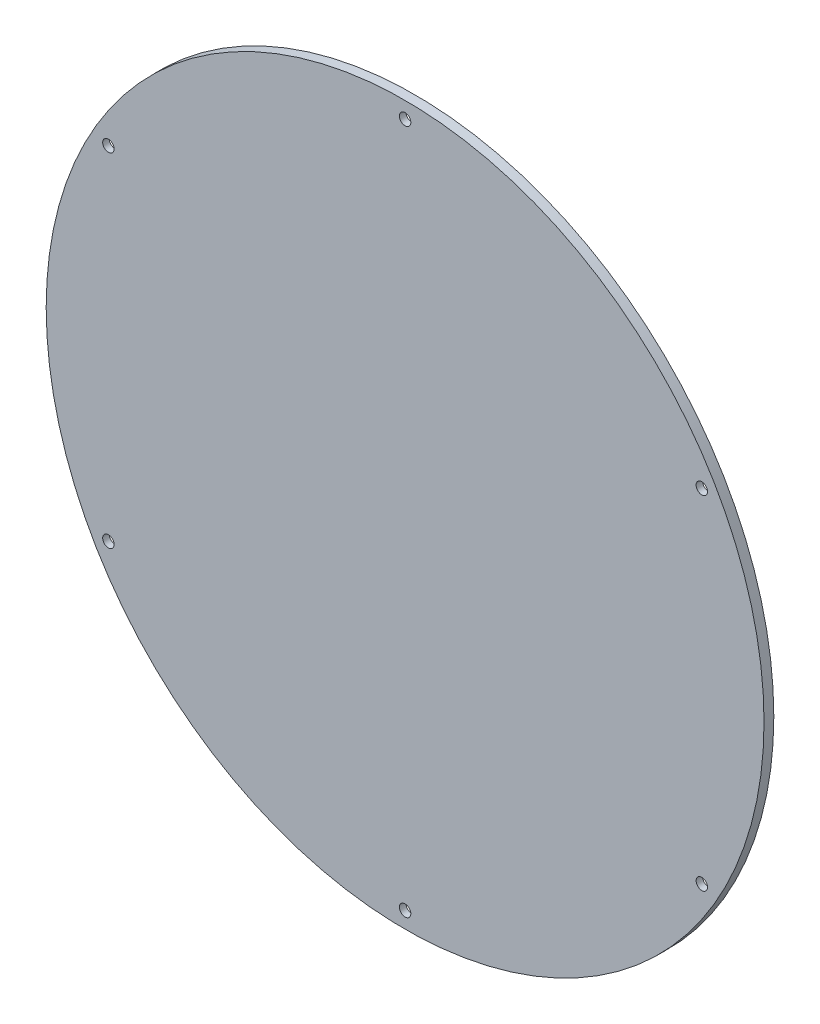
ISO-10303-21;
HEADER;
FILE_DESCRIPTION(('STEP AP214'),'2;1');
FILE_NAME('part.step','',(''),(''),'','','');
FILE_SCHEMA(('AUTOMOTIVE_DESIGN { 1 0 10303 214 1 1 1 1 }'));
ENDSEC;
DATA;
#1=APPLICATION_CONTEXT('core data for automotive mechanical design processes');
#2=APPLICATION_PROTOCOL_DEFINITION('international standard','automotive_design',2000,#1);
#3=PRODUCT_CONTEXT('',#1,'mechanical');
#4=PRODUCT('Part','Part','',(#3));
#5=PRODUCT_RELATED_PRODUCT_CATEGORY('part','',(#4));
#6=PRODUCT_DEFINITION_FORMATION('','',#4);
#7=PRODUCT_DEFINITION_CONTEXT('part definition',#1,'design');
#8=PRODUCT_DEFINITION('design','',#6,#7);
#9=PRODUCT_DEFINITION_SHAPE('','',#8);
#10=(LENGTH_UNIT() NAMED_UNIT(*) SI_UNIT(.MILLI.,.METRE.));
#11=(NAMED_UNIT(*) PLANE_ANGLE_UNIT() SI_UNIT($,.RADIAN.));
#12=(NAMED_UNIT(*) SI_UNIT($,.STERADIAN.) SOLID_ANGLE_UNIT());
#13=UNCERTAINTY_MEASURE_WITH_UNIT(LENGTH_MEASURE(1.E-05),#10,'distance_accuracy_value','');
#14=(GEOMETRIC_REPRESENTATION_CONTEXT(3) GLOBAL_UNCERTAINTY_ASSIGNED_CONTEXT((#13)) GLOBAL_UNIT_ASSIGNED_CONTEXT((#10,
#11,#12)) REPRESENTATION_CONTEXT('',''));
#15=CARTESIAN_POINT('',(0.,0.,0.));
#16=DIRECTION('',(0.,0.,1.));
#17=DIRECTION('',(1.,0.,0.));
#18=AXIS2_PLACEMENT_3D('',#15,#16,#17);
#19=CARTESIAN_POINT('',(0.,0.,3.));
#20=DIRECTION('',(0.,0.,1.));
#21=DIRECTION('',(1.,0.,0.));
#22=AXIS2_PLACEMENT_3D('',#19,#20,#21);
#23=PLANE('',#22);
#24=CARTESIAN_POINT('',(-90.9326673973593,-52.5000000000039,3.));
#25=DIRECTION('',(0.,0.,1.));
#26=DIRECTION('',(1.,0.,0.));
#27=AXIS2_PLACEMENT_3D('',#24,#25,#26);
#28=CIRCLE('',#27,1.75000000000851);
#29=CARTESIAN_POINT('',(-89.1826673973508,-52.5000000000039,3.));
#30=VERTEX_POINT('',#29);
#31=EDGE_CURVE('E92',#30,#30,#28,.T.);
#32=ORIENTED_EDGE('',*,*,#31,.F.);
#33=EDGE_LOOP('',(#32));
#34=FACE_BOUND('',#33,.T.);
#35=CARTESIAN_POINT('',(90.9326673973728,-52.4999999999961,3.));
#36=DIRECTION('',(0.,0.,1.));
#37=DIRECTION('',(1.,0.,0.));
#38=AXIS2_PLACEMENT_3D('',#35,#36,#37);
#39=CIRCLE('',#38,1.75000000000575);
#40=CARTESIAN_POINT('',(92.6826673973785,-52.4999999999961,3.));
#41=VERTEX_POINT('',#40);
#42=EDGE_CURVE('E86',#41,#41,#39,.T.);
#43=ORIENTED_EDGE('',*,*,#42,.F.);
#44=EDGE_LOOP('',(#43));
#45=FACE_BOUND('',#44,.T.);
#46=CARTESIAN_POINT('',(0.,105.,3.));
#47=DIRECTION('',(0.,0.,1.));
#48=DIRECTION('',(1.,0.,0.));
#49=AXIS2_PLACEMENT_3D('',#46,#47,#48);
#50=CIRCLE('',#49,1.75);
#51=CARTESIAN_POINT('',(1.75,105.,3.));
#52=VERTEX_POINT('',#51);
#53=EDGE_CURVE('E78',#52,#52,#50,.T.);
#54=ORIENTED_EDGE('',*,*,#53,.F.);
#55=EDGE_LOOP('',(#54));
#56=FACE_BOUND('',#55,.T.);
#57=CARTESIAN_POINT('',(0.,0.,3.));
#58=DIRECTION('',(0.,0.,1.));
#59=DIRECTION('',(1.,0.,0.));
#60=AXIS2_PLACEMENT_3D('',#57,#58,#59);
#61=CIRCLE('',#60,110.);
#62=CARTESIAN_POINT('',(110.,0.,3.));
#63=VERTEX_POINT('',#62);
#64=EDGE_CURVE('E74',#63,#63,#61,.T.);
#65=ORIENTED_EDGE('',*,*,#64,.T.);
#66=EDGE_LOOP('',(#65));
#67=FACE_BOUND('',#66,.T.);
#68=CARTESIAN_POINT('',(90.9326673973683,52.5000000000039,3.));
#69=DIRECTION('',(0.,0.,1.));
#70=DIRECTION('',(1.,0.,0.));
#71=AXIS2_PLACEMENT_3D('',#68,#69,#70);
#72=CIRCLE('',#71,1.75000000000127);
#73=CARTESIAN_POINT('',(92.6826673973695,52.5000000000039,3.));
#74=VERTEX_POINT('',#73);
#75=EDGE_CURVE('E83',#74,#74,#72,.T.);
#76=ORIENTED_EDGE('',*,*,#75,.F.);
#77=EDGE_LOOP('',(#76));
#78=FACE_BOUND('',#77,.T.);
#79=CARTESIAN_POINT('',(8.92712088779517E-12,-105.,3.));
#80=DIRECTION('',(0.,0.,1.));
#81=DIRECTION('',(1.,0.,0.));
#82=AXIS2_PLACEMENT_3D('',#79,#80,#81);
#83=CIRCLE('',#82,1.75000000000924);
#84=CARTESIAN_POINT('',(1.75000000001817,-105.,3.));
#85=VERTEX_POINT('',#84);
#86=EDGE_CURVE('E89',#85,#85,#83,.T.);
#87=ORIENTED_EDGE('',*,*,#86,.F.);
#88=EDGE_LOOP('',(#87));
#89=FACE_BOUND('',#88,.T.);
#90=CARTESIAN_POINT('',(-90.9326673973639,52.4999999999961,3.));
#91=DIRECTION('',(0.,0.,1.));
#92=DIRECTION('',(1.,0.,0.));
#93=AXIS2_PLACEMENT_3D('',#90,#91,#92);
#94=CIRCLE('',#93,1.75000000000452);
#95=CARTESIAN_POINT('',(-89.1826673973594,52.4999999999961,3.));
#96=VERTEX_POINT('',#95);
#97=EDGE_CURVE('E95',#96,#96,#94,.T.);
#98=ORIENTED_EDGE('',*,*,#97,.F.);
#99=EDGE_LOOP('',(#98));
#100=FACE_BOUND('',#99,.T.);
#101=ADVANCED_FACE('F30',(#34,#45,#56,#67,#78,#89,#100),#23,.T.);
#102=CARTESIAN_POINT('',(0.,0.,0.));
#103=DIRECTION('',(0.,0.,1.));
#104=DIRECTION('',(1.,0.,0.));
#105=AXIS2_PLACEMENT_3D('',#102,#103,#104);
#106=PLANE('',#105);
#107=CARTESIAN_POINT('',(-90.9326673973639,52.4999999999961,0.));
#108=DIRECTION('',(0.,0.,1.));
#109=DIRECTION('',(1.,0.,0.));
#110=AXIS2_PLACEMENT_3D('',#107,#108,#109);
#111=CIRCLE('',#110,3.48205080757347);
#112=CARTESIAN_POINT('',(-87.4506165897904,52.4999999999961,0.));
#113=VERTEX_POINT('',#112);
#114=EDGE_CURVE('E53',#113,#113,#111,.T.);
#115=ORIENTED_EDGE('',*,*,#114,.T.);
#116=EDGE_LOOP('',(#115));
#117=FACE_BOUND('',#116,.T.);
#118=CARTESIAN_POINT('',(-90.9326673973593,-52.5000000000039,0.));
#119=DIRECTION('',(0.,0.,1.));
#120=DIRECTION('',(1.,0.,0.));
#121=AXIS2_PLACEMENT_3D('',#118,#119,#120);
#122=CIRCLE('',#121,3.48205080757741);
#123=CARTESIAN_POINT('',(-87.4506165897819,-52.5000000000039,0.));
#124=VERTEX_POINT('',#123);
#125=EDGE_CURVE('E56',#124,#124,#122,.T.);
#126=ORIENTED_EDGE('',*,*,#125,.T.);
#127=EDGE_LOOP('',(#126));
#128=FACE_BOUND('',#127,.T.);
#129=CARTESIAN_POINT('',(8.92712088779517E-12,-105.,0.));
#130=DIRECTION('',(0.,0.,1.));
#131=DIRECTION('',(1.,0.,0.));
#132=AXIS2_PLACEMENT_3D('',#129,#130,#131);
#133=CIRCLE('',#132,3.48205080757819);
#134=CARTESIAN_POINT('',(3.48205080758711,-105.,0.));
#135=VERTEX_POINT('',#134);
#136=EDGE_CURVE('E59',#135,#135,#133,.T.);
#137=ORIENTED_EDGE('',*,*,#136,.T.);
#138=EDGE_LOOP('',(#137));
#139=FACE_BOUND('',#138,.T.);
#140=CARTESIAN_POINT('',(90.9326673973728,-52.4999999999961,0.));
#141=DIRECTION('',(0.,0.,1.));
#142=DIRECTION('',(1.,0.,0.));
#143=AXIS2_PLACEMENT_3D('',#140,#141,#142);
#144=CIRCLE('',#143,3.48205080757463);
#145=CARTESIAN_POINT('',(94.4147182049474,-52.4999999999961,0.));
#146=VERTEX_POINT('',#145);
#147=EDGE_CURVE('E62',#146,#146,#144,.T.);
#148=ORIENTED_EDGE('',*,*,#147,.T.);
#149=EDGE_LOOP('',(#148));
#150=FACE_BOUND('',#149,.T.);
#151=CARTESIAN_POINT('',(90.9326673973683,52.5000000000039,0.));
#152=DIRECTION('',(0.,0.,1.));
#153=DIRECTION('',(1.,0.,0.));
#154=AXIS2_PLACEMENT_3D('',#151,#152,#153);
#155=CIRCLE('',#154,3.48205080757019);
#156=CARTESIAN_POINT('',(94.4147182049385,52.5000000000039,0.));
#157=VERTEX_POINT('',#156);
#158=EDGE_CURVE('E65',#157,#157,#155,.T.);
#159=ORIENTED_EDGE('',*,*,#158,.T.);
#160=EDGE_LOOP('',(#159));
#161=FACE_BOUND('',#160,.T.);
#162=CARTESIAN_POINT('',(0.,105.,0.));
#163=DIRECTION('',(0.,0.,1.));
#164=DIRECTION('',(1.,0.,0.));
#165=AXIS2_PLACEMENT_3D('',#162,#163,#164);
#166=CIRCLE('',#165,3.48205080756897);
#167=CARTESIAN_POINT('',(3.48205080756897,105.,0.));
#168=VERTEX_POINT('',#167);
#169=EDGE_CURVE('E71',#168,#168,#166,.T.);
#170=ORIENTED_EDGE('',*,*,#169,.T.);
#171=EDGE_LOOP('',(#170));
#172=FACE_BOUND('',#171,.T.);
#173=CARTESIAN_POINT('',(0.,0.,0.));
#174=DIRECTION('',(0.,0.,1.));
#175=DIRECTION('',(1.,0.,0.));
#176=AXIS2_PLACEMENT_3D('',#173,#174,#175);
#177=CIRCLE('',#176,110.);
#178=CARTESIAN_POINT('',(110.,0.,0.));
#179=VERTEX_POINT('',#178);
#180=EDGE_CURVE('E75',#179,#179,#177,.T.);
#181=ORIENTED_EDGE('',*,*,#180,.F.);
#182=EDGE_LOOP('',(#181));
#183=FACE_BOUND('',#182,.T.);
#184=ADVANCED_FACE('F102',(#117,#128,#139,#150,#161,#172,#183),#106,.F.);
#185=CARTESIAN_POINT('',(0.,0.,3.));
#186=DIRECTION('',(0.,0.,-1.));
#187=DIRECTION('',(-1.,0.,0.));
#188=AXIS2_PLACEMENT_3D('',#185,#186,#187);
#189=CYLINDRICAL_SURFACE('',#188,110.);
#190=ORIENTED_EDGE('',*,*,#64,.F.);
#191=EDGE_LOOP('',(#190));
#192=FACE_BOUND('',#191,.T.);
#193=ORIENTED_EDGE('',*,*,#180,.T.);
#194=EDGE_LOOP('',(#193));
#195=FACE_BOUND('',#194,.T.);
#196=ADVANCED_FACE('F108',(#192,#195),#189,.T.);
#197=CARTESIAN_POINT('',(0.,105.,3.));
#198=DIRECTION('',(0.,0.,-1.));
#199=DIRECTION('',(-1.,0.,0.));
#200=AXIS2_PLACEMENT_3D('',#197,#198,#199);
#201=CYLINDRICAL_SURFACE('',#200,1.75);
#202=CARTESIAN_POINT('',(0.,105.,1.00000000000005));
#203=DIRECTION('',(0.,0.,1.));
#204=DIRECTION('',(1.,0.,0.));
#205=AXIS2_PLACEMENT_3D('',#202,#203,#204);
#206=CIRCLE('',#205,1.75);
#207=CARTESIAN_POINT('',(1.75,105.,1.00000000000005));
#208=VERTEX_POINT('',#207);
#209=EDGE_CURVE('E68',#208,#208,#206,.F.);
#210=ORIENTED_EDGE('',*,*,#209,.T.);
#211=EDGE_LOOP('',(#210));
#212=FACE_BOUND('',#211,.T.);
#213=ORIENTED_EDGE('',*,*,#53,.T.);
#214=EDGE_LOOP('',(#213));
#215=FACE_BOUND('',#214,.T.);
#216=ADVANCED_FACE('F114',(#212,#215),#201,.F.);
#217=CARTESIAN_POINT('',(90.9326673973683,52.5000000000039,3.));
#218=DIRECTION('',(0.,0.,-1.));
#219=DIRECTION('',(-1.,0.,0.));
#220=AXIS2_PLACEMENT_3D('',#217,#218,#219);
#221=CYLINDRICAL_SURFACE('',#220,1.75000000000127);
#222=CARTESIAN_POINT('',(90.9326673973683,52.5000000000039,1.00000000000002));
#223=DIRECTION('',(0.,0.,1.));
#224=DIRECTION('',(1.,0.,0.));
#225=AXIS2_PLACEMENT_3D('',#222,#223,#224);
#226=CIRCLE('',#225,1.75000000000127);
#227=CARTESIAN_POINT('',(92.6826673973695,52.5000000000039,1.00000000000002));
#228=VERTEX_POINT('',#227);
#229=EDGE_CURVE('E10',#228,#228,#226,.F.);
#230=ORIENTED_EDGE('',*,*,#229,.T.);
#231=EDGE_LOOP('',(#230));
#232=FACE_BOUND('',#231,.T.);
#233=ORIENTED_EDGE('',*,*,#75,.T.);
#234=EDGE_LOOP('',(#233));
#235=FACE_BOUND('',#234,.T.);
#236=ADVANCED_FACE('F218',(#232,#235),#221,.F.);
#237=CARTESIAN_POINT('',(90.9326673973728,-52.4999999999961,3.));
#238=DIRECTION('',(0.,0.,-1.));
#239=DIRECTION('',(-1.,0.,0.));
#240=AXIS2_PLACEMENT_3D('',#237,#238,#239);
#241=CYLINDRICAL_SURFACE('',#240,1.75000000000575);
#242=CARTESIAN_POINT('',(90.9326673973728,-52.4999999999961,0.999999999999987));
#243=DIRECTION('',(0.,0.,1.));
#244=DIRECTION('',(1.,0.,0.));
#245=AXIS2_PLACEMENT_3D('',#242,#243,#244);
#246=CIRCLE('',#245,1.75000000000575);
#247=CARTESIAN_POINT('',(92.6826673973785,-52.4999999999961,0.999999999999987));
#248=VERTEX_POINT('',#247);
#249=EDGE_CURVE('E37',#248,#248,#246,.F.);
#250=ORIENTED_EDGE('',*,*,#249,.T.);
#251=EDGE_LOOP('',(#250));
#252=FACE_BOUND('',#251,.T.);
#253=ORIENTED_EDGE('',*,*,#42,.T.);
#254=EDGE_LOOP('',(#253));
#255=FACE_BOUND('',#254,.T.);
#256=ADVANCED_FACE('F208',(#252,#255),#241,.F.);
#257=CARTESIAN_POINT('',(8.92712088779517E-12,-105.,3.));
#258=DIRECTION('',(0.,0.,-1.));
#259=DIRECTION('',(-1.,0.,0.));
#260=AXIS2_PLACEMENT_3D('',#257,#258,#259);
#261=CYLINDRICAL_SURFACE('',#260,1.75000000000924);
#262=CARTESIAN_POINT('',(8.92712088779517E-12,-105.,1.00000000000005));
#263=DIRECTION('',(0.,0.,1.));
#264=DIRECTION('',(1.,0.,0.));
#265=AXIS2_PLACEMENT_3D('',#262,#263,#264);
#266=CIRCLE('',#265,1.75000000000924);
#267=CARTESIAN_POINT('',(1.75000000001817,-105.,1.00000000000005));
#268=VERTEX_POINT('',#267);
#269=EDGE_CURVE('E41',#268,#268,#266,.F.);
#270=ORIENTED_EDGE('',*,*,#269,.T.);
#271=EDGE_LOOP('',(#270));
#272=FACE_BOUND('',#271,.T.);
#273=ORIENTED_EDGE('',*,*,#86,.T.);
#274=EDGE_LOOP('',(#273));
#275=FACE_BOUND('',#274,.T.);
#276=ADVANCED_FACE('F198',(#272,#275),#261,.F.);
#277=CARTESIAN_POINT('',(-90.9326673973593,-52.5000000000039,3.));
#278=DIRECTION('',(0.,0.,-1.));
#279=DIRECTION('',(-1.,0.,0.));
#280=AXIS2_PLACEMENT_3D('',#277,#278,#279);
#281=CYLINDRICAL_SURFACE('',#280,1.75000000000851);
#282=CARTESIAN_POINT('',(-90.9326673973593,-52.5000000000039,1.));
#283=DIRECTION('',(0.,0.,1.));
#284=DIRECTION('',(1.,0.,0.));
#285=AXIS2_PLACEMENT_3D('',#282,#283,#284);
#286=CIRCLE('',#285,1.75000000000851);
#287=CARTESIAN_POINT('',(-89.1826673973508,-52.5000000000039,1.));
#288=VERTEX_POINT('',#287);
#289=EDGE_CURVE('E45',#288,#288,#286,.F.);
#290=ORIENTED_EDGE('',*,*,#289,.T.);
#291=EDGE_LOOP('',(#290));
#292=FACE_BOUND('',#291,.T.);
#293=ORIENTED_EDGE('',*,*,#31,.T.);
#294=EDGE_LOOP('',(#293));
#295=FACE_BOUND('',#294,.T.);
#296=ADVANCED_FACE('F188',(#292,#295),#281,.F.);
#297=CARTESIAN_POINT('',(-90.9326673973639,52.4999999999961,3.));
#298=DIRECTION('',(0.,0.,-1.));
#299=DIRECTION('',(-1.,0.,0.));
#300=AXIS2_PLACEMENT_3D('',#297,#298,#299);
#301=CYLINDRICAL_SURFACE('',#300,1.75000000000452);
#302=CARTESIAN_POINT('',(-90.9326673973639,52.4999999999961,1.00000000000003));
#303=DIRECTION('',(0.,0.,1.));
#304=DIRECTION('',(1.,0.,0.));
#305=AXIS2_PLACEMENT_3D('',#302,#303,#304);
#306=CIRCLE('',#305,1.75000000000452);
#307=CARTESIAN_POINT('',(-89.1826673973594,52.4999999999961,1.00000000000003));
#308=VERTEX_POINT('',#307);
#309=EDGE_CURVE('E50',#308,#308,#306,.F.);
#310=ORIENTED_EDGE('',*,*,#309,.T.);
#311=EDGE_LOOP('',(#310));
#312=FACE_BOUND('',#311,.T.);
#313=ORIENTED_EDGE('',*,*,#97,.T.);
#314=EDGE_LOOP('',(#313));
#315=FACE_BOUND('',#314,.T.);
#316=ADVANCED_FACE('F99',(#312,#315),#301,.F.);
#317=CARTESIAN_POINT('',(0.,105.,0.));
#318=DIRECTION('',(0.,0.,-1.));
#319=DIRECTION('',(-1.,0.,0.));
#320=AXIS2_PLACEMENT_3D('',#317,#318,#319);
#321=CONICAL_SURFACE('',#320,3.48205080756897,1.0471975511966);
#322=ORIENTED_EDGE('',*,*,#209,.F.);
#323=EDGE_LOOP('',(#322));
#324=FACE_BOUND('',#323,.T.);
#325=ORIENTED_EDGE('',*,*,#169,.F.);
#326=EDGE_LOOP('',(#325));
#327=FACE_BOUND('',#326,.T.);
#328=ADVANCED_FACE('F120',(#324,#327),#321,.F.);
#329=CARTESIAN_POINT('',(-90.9326673973639,52.4999999999961,0.));
#330=DIRECTION('',(0.,0.,-1.));
#331=DIRECTION('',(-1.,0.,0.));
#332=AXIS2_PLACEMENT_3D('',#329,#330,#331);
#333=CONICAL_SURFACE('',#332,3.48205080757347,1.0471975511966);
#334=ORIENTED_EDGE('',*,*,#309,.F.);
#335=EDGE_LOOP('',(#334));
#336=FACE_BOUND('',#335,.T.);
#337=ORIENTED_EDGE('',*,*,#114,.F.);
#338=EDGE_LOOP('',(#337));
#339=FACE_BOUND('',#338,.T.);
#340=ADVANCED_FACE('F123',(#336,#339),#333,.F.);
#341=CARTESIAN_POINT('',(-90.9326673973593,-52.5000000000039,0.));
#342=DIRECTION('',(0.,0.,-1.));
#343=DIRECTION('',(-1.,0.,0.));
#344=AXIS2_PLACEMENT_3D('',#341,#342,#343);
#345=CONICAL_SURFACE('',#344,3.48205080757741,1.0471975511966);
#346=ORIENTED_EDGE('',*,*,#289,.F.);
#347=EDGE_LOOP('',(#346));
#348=FACE_BOUND('',#347,.T.);
#349=ORIENTED_EDGE('',*,*,#125,.F.);
#350=EDGE_LOOP('',(#349));
#351=FACE_BOUND('',#350,.T.);
#352=ADVANCED_FACE('F127',(#348,#351),#345,.F.);
#353=CARTESIAN_POINT('',(8.92712088779517E-12,-105.,0.));
#354=DIRECTION('',(0.,0.,-1.));
#355=DIRECTION('',(-1.,0.,0.));
#356=AXIS2_PLACEMENT_3D('',#353,#354,#355);
#357=CONICAL_SURFACE('',#356,3.48205080757819,1.0471975511966);
#358=ORIENTED_EDGE('',*,*,#269,.F.);
#359=EDGE_LOOP('',(#358));
#360=FACE_BOUND('',#359,.T.);
#361=ORIENTED_EDGE('',*,*,#136,.F.);
#362=EDGE_LOOP('',(#361));
#363=FACE_BOUND('',#362,.T.);
#364=ADVANCED_FACE('F131',(#360,#363),#357,.F.);
#365=CARTESIAN_POINT('',(90.9326673973728,-52.4999999999961,0.));
#366=DIRECTION('',(0.,0.,-1.));
#367=DIRECTION('',(-1.,0.,0.));
#368=AXIS2_PLACEMENT_3D('',#365,#366,#367);
#369=CONICAL_SURFACE('',#368,3.48205080757463,1.04719755119661);
#370=ORIENTED_EDGE('',*,*,#249,.F.);
#371=EDGE_LOOP('',(#370));
#372=FACE_BOUND('',#371,.T.);
#373=ORIENTED_EDGE('',*,*,#147,.F.);
#374=EDGE_LOOP('',(#373));
#375=FACE_BOUND('',#374,.T.);
#376=ADVANCED_FACE('F134',(#372,#375),#369,.F.);
#377=CARTESIAN_POINT('',(90.9326673973683,52.5000000000039,0.));
#378=DIRECTION('',(0.,0.,-1.));
#379=DIRECTION('',(-1.,0.,0.));
#380=AXIS2_PLACEMENT_3D('',#377,#378,#379);
#381=CONICAL_SURFACE('',#380,3.48205080757019,1.0471975511966);
#382=ORIENTED_EDGE('',*,*,#229,.F.);
#383=EDGE_LOOP('',(#382));
#384=FACE_BOUND('',#383,.T.);
#385=ORIENTED_EDGE('',*,*,#158,.F.);
#386=EDGE_LOOP('',(#385));
#387=FACE_BOUND('',#386,.T.);
#388=ADVANCED_FACE('F32',(#384,#387),#381,.F.);
#389=CLOSED_SHELL('',(#101,#184,#196,#216,#236,#256,#276,#296,#316,#328,#340,#352,#364,#376,#388));
#390=MANIFOLD_SOLID_BREP('B2',#389);
#391=ADVANCED_BREP_SHAPE_REPRESENTATION('',(#18,#390),#14);
#392=SHAPE_DEFINITION_REPRESENTATION(#9,#391);
ENDSEC;
END-ISO-10303-21;
